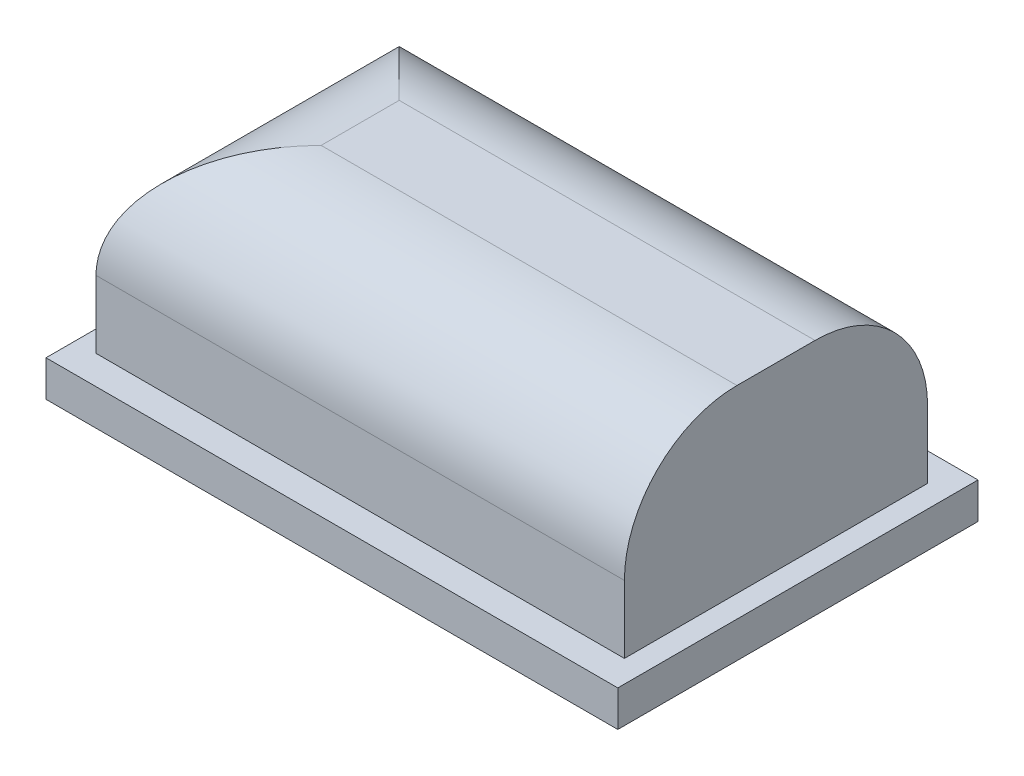
ISO-10303-21;
HEADER;
FILE_DESCRIPTION(('STEP AP214'),'2;1');
FILE_NAME('part.step','',(''),(''),'','','');
FILE_SCHEMA(('AUTOMOTIVE_DESIGN { 1 0 10303 214 1 1 1 1 }'));
ENDSEC;
DATA;
#1=APPLICATION_CONTEXT('core data for automotive mechanical design processes');
#2=APPLICATION_PROTOCOL_DEFINITION('international standard','automotive_design',2000,#1);
#3=PRODUCT_CONTEXT('',#1,'mechanical');
#4=PRODUCT('Part','Part','',(#3));
#5=PRODUCT_RELATED_PRODUCT_CATEGORY('part','',(#4));
#6=PRODUCT_DEFINITION_FORMATION('','',#4);
#7=PRODUCT_DEFINITION_CONTEXT('part definition',#1,'design');
#8=PRODUCT_DEFINITION('design','',#6,#7);
#9=PRODUCT_DEFINITION_SHAPE('','',#8);
#10=(LENGTH_UNIT() NAMED_UNIT(*) SI_UNIT(.MILLI.,.METRE.));
#11=(NAMED_UNIT(*) PLANE_ANGLE_UNIT() SI_UNIT($,.RADIAN.));
#12=(NAMED_UNIT(*) SI_UNIT($,.STERADIAN.) SOLID_ANGLE_UNIT());
#13=UNCERTAINTY_MEASURE_WITH_UNIT(LENGTH_MEASURE(1.E-05),#10,'distance_accuracy_value','');
#14=(GEOMETRIC_REPRESENTATION_CONTEXT(3) GLOBAL_UNCERTAINTY_ASSIGNED_CONTEXT((#13)) GLOBAL_UNIT_ASSIGNED_CONTEXT((#10,
#11,#12)) REPRESENTATION_CONTEXT('',''));
#15=CARTESIAN_POINT('',(0.,0.,0.));
#16=DIRECTION('',(0.,0.,1.));
#17=DIRECTION('',(1.,0.,0.));
#18=AXIS2_PLACEMENT_3D('',#15,#16,#17);
#19=CARTESIAN_POINT('',(0.,1.6,0.));
#20=DIRECTION('',(0.,-1.,0.));
#21=DIRECTION('',(0.,0.,-1.));
#22=AXIS2_PLACEMENT_3D('',#19,#20,#21);
#23=PLANE('',#22);
#24=DIRECTION('',(0.,0.,1.));
#25=VECTOR('',#24,1.);
#26=CARTESIAN_POINT('',(0.,1.6,0.));
#27=LINE('',#26,#25);
#28=CARTESIAN_POINT('',(0.,1.6,-16.));
#29=VERTEX_POINT('',#28);
#30=CARTESIAN_POINT('',(0.,1.6,0.));
#31=VERTEX_POINT('',#30);
#32=EDGE_CURVE('E140',#29,#31,#27,.T.);
#33=ORIENTED_EDGE('',*,*,#32,.T.);
#34=DIRECTION('',(1.,0.,0.));
#35=VECTOR('',#34,1.);
#36=CARTESIAN_POINT('',(0.,1.6,0.));
#37=LINE('',#36,#35);
#38=CARTESIAN_POINT('',(25.4,1.6,0.));
#39=VERTEX_POINT('',#38);
#40=EDGE_CURVE('E143',#31,#39,#37,.T.);
#41=ORIENTED_EDGE('',*,*,#40,.T.);
#42=DIRECTION('',(0.,0.,-1.));
#43=VECTOR('',#42,1.);
#44=CARTESIAN_POINT('',(25.4,1.6,0.));
#45=LINE('',#44,#43);
#46=CARTESIAN_POINT('',(25.4,1.6,-16.));
#47=VERTEX_POINT('',#46);
#48=EDGE_CURVE('E146',#39,#47,#45,.T.);
#49=ORIENTED_EDGE('',*,*,#48,.T.);
#50=DIRECTION('',(-1.,0.,0.));
#51=VECTOR('',#50,1.);
#52=CARTESIAN_POINT('',(0.,1.6,-16.));
#53=LINE('',#52,#51);
#54=EDGE_CURVE('E148',#47,#29,#53,.T.);
#55=ORIENTED_EDGE('',*,*,#54,.T.);
#56=EDGE_LOOP('',(#33,#41,#49,#55));
#57=FACE_BOUND('',#56,.T.);
#58=DIRECTION('',(0.,0.,1.));
#59=VECTOR('',#58,1.);
#60=CARTESIAN_POINT('',(0.941878804781027,1.6,-1.28026775479384));
#61=LINE('',#60,#59);
#62=CARTESIAN_POINT('',(0.941878804781027,1.6,-14.7469678998959));
#63=VERTEX_POINT('',#62);
#64=CARTESIAN_POINT('',(0.941878804781027,1.6,-1.28026775479384));
#65=VERTEX_POINT('',#64);
#66=EDGE_CURVE('E128',#63,#65,#61,.T.);
#67=ORIENTED_EDGE('',*,*,#66,.F.);
#68=DIRECTION('',(-1.,0.,0.));
#69=VECTOR('',#68,1.);
#70=CARTESIAN_POINT('',(0.941878804781027,1.6,-14.7469678998959));
#71=LINE('',#70,#69);
#72=CARTESIAN_POINT('',(24.413407163081,1.6,-14.7469678998959));
#73=VERTEX_POINT('',#72);
#74=EDGE_CURVE('E125',#73,#63,#71,.T.);
#75=ORIENTED_EDGE('',*,*,#74,.F.);
#76=DIRECTION('',(0.,0.,-1.));
#77=VECTOR('',#76,1.);
#78=CARTESIAN_POINT('',(24.413407163081,1.6,-1.28026775479384));
#79=LINE('',#78,#77);
#80=CARTESIAN_POINT('',(24.413407163081,1.6,-1.28026775479384));
#81=VERTEX_POINT('',#80);
#82=EDGE_CURVE('E113',#81,#73,#79,.T.);
#83=ORIENTED_EDGE('',*,*,#82,.F.);
#84=DIRECTION('',(1.,0.,0.));
#85=VECTOR('',#84,1.);
#86=CARTESIAN_POINT('',(0.941878804781027,1.6,-1.28026775479384));
#87=LINE('',#86,#85);
#88=EDGE_CURVE('E122',#65,#81,#87,.T.);
#89=ORIENTED_EDGE('',*,*,#88,.F.);
#90=EDGE_LOOP('',(#67,#75,#83,#89));
#91=FACE_BOUND('',#90,.T.);
#92=ADVANCED_FACE('F33',(#57,#91),#23,.F.);
#93=CARTESIAN_POINT('',(0.,1.6,0.));
#94=DIRECTION('',(1.,0.,0.));
#95=DIRECTION('',(0.,0.,-1.));
#96=AXIS2_PLACEMENT_3D('',#93,#94,#95);
#97=PLANE('',#96);
#98=DIRECTION('',(0.,0.,1.));
#99=VECTOR('',#98,1.);
#100=CARTESIAN_POINT('',(0.,0.,0.));
#101=LINE('',#100,#99);
#102=CARTESIAN_POINT('',(0.,0.,-16.));
#103=VERTEX_POINT('',#102);
#104=CARTESIAN_POINT('',(0.,0.,0.));
#105=VERTEX_POINT('',#104);
#106=EDGE_CURVE('E139',#103,#105,#101,.T.);
#107=ORIENTED_EDGE('',*,*,#106,.T.);
#108=DIRECTION('',(0.,-1.,0.));
#109=VECTOR('',#108,1.);
#110=CARTESIAN_POINT('',(0.,1.6,0.));
#111=LINE('',#110,#109);
#112=EDGE_CURVE('E166',#31,#105,#111,.T.);
#113=ORIENTED_EDGE('',*,*,#112,.F.);
#114=ORIENTED_EDGE('',*,*,#32,.F.);
#115=DIRECTION('',(0.,-1.,0.));
#116=VECTOR('',#115,1.);
#117=CARTESIAN_POINT('',(0.,1.6,-16.));
#118=LINE('',#117,#116);
#119=EDGE_CURVE('E150',#29,#103,#118,.T.);
#120=ORIENTED_EDGE('',*,*,#119,.T.);
#121=EDGE_LOOP('',(#107,#113,#114,#120));
#122=FACE_BOUND('',#121,.T.);
#123=ADVANCED_FACE('F217',(#122),#97,.F.);
#124=CARTESIAN_POINT('',(0.,1.6,0.));
#125=DIRECTION('',(0.,0.,-1.));
#126=DIRECTION('',(-1.,0.,0.));
#127=AXIS2_PLACEMENT_3D('',#124,#125,#126);
#128=PLANE('',#127);
#129=DIRECTION('',(1.,0.,0.));
#130=VECTOR('',#129,1.);
#131=CARTESIAN_POINT('',(0.,0.,0.));
#132=LINE('',#131,#130);
#133=CARTESIAN_POINT('',(25.4,0.,0.));
#134=VERTEX_POINT('',#133);
#135=EDGE_CURVE('E153',#105,#134,#132,.T.);
#136=ORIENTED_EDGE('',*,*,#135,.T.);
#137=DIRECTION('',(0.,-1.,0.));
#138=VECTOR('',#137,1.);
#139=CARTESIAN_POINT('',(25.4,1.6,0.));
#140=LINE('',#139,#138);
#141=EDGE_CURVE('E163',#39,#134,#140,.T.);
#142=ORIENTED_EDGE('',*,*,#141,.F.);
#143=ORIENTED_EDGE('',*,*,#40,.F.);
#144=ORIENTED_EDGE('',*,*,#112,.T.);
#145=EDGE_LOOP('',(#136,#142,#143,#144));
#146=FACE_BOUND('',#145,.T.);
#147=ADVANCED_FACE('F222',(#146),#128,.F.);
#148=CARTESIAN_POINT('',(25.4,1.6,0.));
#149=DIRECTION('',(-1.,0.,0.));
#150=DIRECTION('',(0.,0.,1.));
#151=AXIS2_PLACEMENT_3D('',#148,#149,#150);
#152=PLANE('',#151);
#153=DIRECTION('',(0.,0.,-1.));
#154=VECTOR('',#153,1.);
#155=CARTESIAN_POINT('',(25.4,0.,0.));
#156=LINE('',#155,#154);
#157=CARTESIAN_POINT('',(25.4,0.,-16.));
#158=VERTEX_POINT('',#157);
#159=EDGE_CURVE('E155',#134,#158,#156,.T.);
#160=ORIENTED_EDGE('',*,*,#159,.T.);
#161=DIRECTION('',(0.,-1.,0.));
#162=VECTOR('',#161,1.);
#163=CARTESIAN_POINT('',(25.4,1.6,-16.));
#164=LINE('',#163,#162);
#165=EDGE_CURVE('E160',#47,#158,#164,.T.);
#166=ORIENTED_EDGE('',*,*,#165,.F.);
#167=ORIENTED_EDGE('',*,*,#48,.F.);
#168=ORIENTED_EDGE('',*,*,#141,.T.);
#169=EDGE_LOOP('',(#160,#166,#167,#168));
#170=FACE_BOUND('',#169,.T.);
#171=ADVANCED_FACE('F228',(#170),#152,.F.);
#172=CARTESIAN_POINT('',(0.,1.6,-16.));
#173=DIRECTION('',(0.,0.,1.));
#174=DIRECTION('',(1.,0.,0.));
#175=AXIS2_PLACEMENT_3D('',#172,#173,#174);
#176=PLANE('',#175);
#177=DIRECTION('',(-1.,0.,0.));
#178=VECTOR('',#177,1.);
#179=CARTESIAN_POINT('',(0.,0.,-16.));
#180=LINE('',#179,#178);
#181=EDGE_CURVE('E144',#158,#103,#180,.T.);
#182=ORIENTED_EDGE('',*,*,#181,.T.);
#183=ORIENTED_EDGE('',*,*,#119,.F.);
#184=ORIENTED_EDGE('',*,*,#54,.F.);
#185=ORIENTED_EDGE('',*,*,#165,.T.);
#186=EDGE_LOOP('',(#182,#183,#184,#185));
#187=FACE_BOUND('',#186,.T.);
#188=ADVANCED_FACE('F212',(#187),#176,.F.);
#189=CARTESIAN_POINT('',(0.,0.,0.));
#190=DIRECTION('',(0.,-1.,0.));
#191=DIRECTION('',(0.,0.,-1.));
#192=AXIS2_PLACEMENT_3D('',#189,#190,#191);
#193=PLANE('',#192);
#194=ORIENTED_EDGE('',*,*,#106,.F.);
#195=ORIENTED_EDGE('',*,*,#181,.F.);
#196=ORIENTED_EDGE('',*,*,#159,.F.);
#197=ORIENTED_EDGE('',*,*,#135,.F.);
#198=EDGE_LOOP('',(#194,#195,#196,#197));
#199=FACE_BOUND('',#198,.T.);
#200=ADVANCED_FACE('F205',(#199),#193,.T.);
#201=CARTESIAN_POINT('',(0.941878804781027,9.6,-1.28026775479384));
#202=DIRECTION('',(1.,0.,0.));
#203=DIRECTION('',(0.,0.,-1.));
#204=AXIS2_PLACEMENT_3D('',#201,#202,#203);
#205=PLANE('',#204);
#206=DIRECTION('',(0.,-1.,0.));
#207=VECTOR('',#206,1.);
#208=CARTESIAN_POINT('',(0.941878804781027,9.6,-1.28026775479384));
#209=LINE('',#208,#207);
#210=CARTESIAN_POINT('',(0.941878804781027,4.6,-1.28026775479384));
#211=VERTEX_POINT('',#210);
#212=EDGE_CURVE('E115',#211,#65,#209,.T.);
#213=ORIENTED_EDGE('',*,*,#212,.F.);
#214=DIRECTION('',(0.,0.,1.));
#215=VECTOR('',#214,1.);
#216=CARTESIAN_POINT('',(0.941878804781027,4.6,-1.28026775479384));
#217=LINE('',#216,#215);
#218=CARTESIAN_POINT('',(0.941878804781027,4.6,-14.7469678998959));
#219=VERTEX_POINT('',#218);
#220=EDGE_CURVE('E11',#211,#219,#217,.F.);
#221=ORIENTED_EDGE('',*,*,#220,.T.);
#222=DIRECTION('',(0.,-1.,0.));
#223=VECTOR('',#222,1.);
#224=CARTESIAN_POINT('',(0.941878804781027,9.6,-14.7469678998959));
#225=LINE('',#224,#223);
#226=EDGE_CURVE('E135',#219,#63,#225,.T.);
#227=ORIENTED_EDGE('',*,*,#226,.T.);
#228=ORIENTED_EDGE('',*,*,#66,.T.);
#229=EDGE_LOOP('',(#213,#221,#227,#228));
#230=FACE_BOUND('',#229,.T.);
#231=ADVANCED_FACE('F203',(#230),#205,.F.);
#232=CARTESIAN_POINT('',(0.941878804781027,9.6,-1.28026775479384));
#233=DIRECTION('',(0.,0.,-1.));
#234=DIRECTION('',(-1.,0.,0.));
#235=AXIS2_PLACEMENT_3D('',#232,#233,#234);
#236=PLANE('',#235);
#237=DIRECTION('',(0.,-1.,0.));
#238=VECTOR('',#237,1.);
#239=CARTESIAN_POINT('',(24.413407163081,9.6,-1.28026775479384));
#240=LINE('',#239,#238);
#241=CARTESIAN_POINT('',(24.413407163081,4.6,-1.28026775479384));
#242=VERTEX_POINT('',#241);
#243=EDGE_CURVE('E109',#242,#81,#240,.T.);
#244=ORIENTED_EDGE('',*,*,#243,.F.);
#245=DIRECTION('',(1.,0.,0.));
#246=VECTOR('',#245,1.);
#247=CARTESIAN_POINT('',(0.941878804781027,4.6,-1.28026775479384));
#248=LINE('',#247,#246);
#249=EDGE_CURVE('E42',#242,#211,#248,.F.);
#250=ORIENTED_EDGE('',*,*,#249,.T.);
#251=ORIENTED_EDGE('',*,*,#212,.T.);
#252=ORIENTED_EDGE('',*,*,#88,.T.);
#253=EDGE_LOOP('',(#244,#250,#251,#252));
#254=FACE_BOUND('',#253,.T.);
#255=ADVANCED_FACE('F127',(#254),#236,.F.);
#256=CARTESIAN_POINT('',(24.413407163081,9.6,-1.28026775479384));
#257=DIRECTION('',(-1.,0.,0.));
#258=DIRECTION('',(0.,0.,1.));
#259=AXIS2_PLACEMENT_3D('',#256,#257,#258);
#260=PLANE('',#259);
#261=DIRECTION('',(0.,-1.,0.));
#262=VECTOR('',#261,1.);
#263=CARTESIAN_POINT('',(24.413407163081,9.6,-14.7469678998959));
#264=LINE('',#263,#262);
#265=CARTESIAN_POINT('',(24.413407163081,4.6,-14.7469678998959));
#266=VERTEX_POINT('',#265);
#267=EDGE_CURVE('E116',#266,#73,#264,.T.);
#268=ORIENTED_EDGE('',*,*,#267,.F.);
#269=CARTESIAN_POINT('',(24.413407163081,4.6,-9.74696789989593));
#270=DIRECTION('',(-1.,0.,0.));
#271=DIRECTION('',(0.,0.,1.));
#272=AXIS2_PLACEMENT_3D('',#269,#270,#271);
#273=CIRCLE('',#272,5.);
#274=CARTESIAN_POINT('',(24.413407163081,9.6,-9.74696789989593));
#275=VERTEX_POINT('',#274);
#276=EDGE_CURVE('E179',#266,#275,#273,.F.);
#277=ORIENTED_EDGE('',*,*,#276,.T.);
#278=DIRECTION('',(0.,0.,-1.));
#279=VECTOR('',#278,1.);
#280=CARTESIAN_POINT('',(24.413407163081,9.6,-1.28026775479384));
#281=LINE('',#280,#279);
#282=CARTESIAN_POINT('',(24.413407163081,9.6,-6.28026775479384));
#283=VERTEX_POINT('',#282);
#284=EDGE_CURVE('E134',#283,#275,#281,.T.);
#285=ORIENTED_EDGE('',*,*,#284,.F.);
#286=CARTESIAN_POINT('',(24.413407163081,4.6,-6.28026775479384));
#287=DIRECTION('',(-1.,0.,0.));
#288=DIRECTION('',(0.,0.,1.));
#289=AXIS2_PLACEMENT_3D('',#286,#287,#288);
#290=CIRCLE('',#289,5.);
#291=EDGE_CURVE('E57',#283,#242,#290,.F.);
#292=ORIENTED_EDGE('',*,*,#291,.T.);
#293=ORIENTED_EDGE('',*,*,#243,.T.);
#294=ORIENTED_EDGE('',*,*,#82,.T.);
#295=EDGE_LOOP('',(#268,#277,#285,#292,#293,#294));
#296=FACE_BOUND('',#295,.T.);
#297=ADVANCED_FACE('F112',(#296),#260,.F.);
#298=CARTESIAN_POINT('',(0.941878804781027,9.6,-14.7469678998959));
#299=DIRECTION('',(0.,0.,1.));
#300=DIRECTION('',(1.,0.,0.));
#301=AXIS2_PLACEMENT_3D('',#298,#299,#300);
#302=PLANE('',#301);
#303=ORIENTED_EDGE('',*,*,#226,.F.);
#304=DIRECTION('',(-1.,0.,0.));
#305=VECTOR('',#304,1.);
#306=CARTESIAN_POINT('',(0.941878804781027,4.6,-14.7469678998959));
#307=LINE('',#306,#305);
#308=EDGE_CURVE('E176',#219,#266,#307,.F.);
#309=ORIENTED_EDGE('',*,*,#308,.T.);
#310=ORIENTED_EDGE('',*,*,#267,.T.);
#311=ORIENTED_EDGE('',*,*,#74,.T.);
#312=EDGE_LOOP('',(#303,#309,#310,#311));
#313=FACE_BOUND('',#312,.T.);
#314=ADVANCED_FACE('F201',(#313),#302,.F.);
#315=CARTESIAN_POINT('',(0.,9.6,0.));
#316=DIRECTION('',(0.,-1.,0.));
#317=DIRECTION('',(0.,0.,-1.));
#318=AXIS2_PLACEMENT_3D('',#315,#316,#317);
#319=PLANE('',#318);
#320=ORIENTED_EDGE('',*,*,#284,.T.);
#321=DIRECTION('',(-1.,0.,0.));
#322=VECTOR('',#321,1.);
#323=CARTESIAN_POINT('',(0.,9.6,-9.74696789989593));
#324=LINE('',#323,#322);
#325=CARTESIAN_POINT('',(5.94187880478103,9.6,-9.74696789989593));
#326=VERTEX_POINT('',#325);
#327=EDGE_CURVE('E173',#275,#326,#324,.T.);
#328=ORIENTED_EDGE('',*,*,#327,.T.);
#329=DIRECTION('',(0.,0.,1.));
#330=VECTOR('',#329,1.);
#331=CARTESIAN_POINT('',(5.94187880478103,9.6,0.));
#332=LINE('',#331,#330);
#333=CARTESIAN_POINT('',(5.94187880478103,9.6,-6.28026775479384));
#334=VERTEX_POINT('',#333);
#335=EDGE_CURVE('E169',#326,#334,#332,.T.);
#336=ORIENTED_EDGE('',*,*,#335,.T.);
#337=DIRECTION('',(1.,0.,0.));
#338=VECTOR('',#337,1.);
#339=CARTESIAN_POINT('',(0.,9.6,-6.28026775479384));
#340=LINE('',#339,#338);
#341=EDGE_CURVE('E171',#334,#283,#340,.T.);
#342=ORIENTED_EDGE('',*,*,#341,.T.);
#343=EDGE_LOOP('',(#320,#328,#336,#342));
#344=FACE_BOUND('',#343,.T.);
#345=ADVANCED_FACE('F196',(#344),#319,.F.);
#346=CARTESIAN_POINT('',(0.,4.6,-6.28026775479384));
#347=DIRECTION('',(1.,0.,0.));
#348=DIRECTION('',(0.,0.,-1.));
#349=AXIS2_PLACEMENT_3D('',#346,#347,#348);
#350=CYLINDRICAL_SURFACE('',#349,5.);
#351=ORIENTED_EDGE('',*,*,#291,.F.);
#352=ORIENTED_EDGE('',*,*,#341,.F.);
#353=CARTESIAN_POINT('',(5.94187880478103,4.6,-6.28026775479384));
#354=DIRECTION('',(0.707106781186547,0.,0.707106781186547));
#355=DIRECTION('',(-0.707106781186547,0.,0.707106781186547));
#356=AXIS2_PLACEMENT_3D('',#353,#354,#355);
#357=ELLIPSE('',#356,7.07106781186547,5.);
#358=EDGE_CURVE('E37',#211,#334,#357,.F.);
#359=ORIENTED_EDGE('',*,*,#358,.F.);
#360=ORIENTED_EDGE('',*,*,#249,.F.);
#361=EDGE_LOOP('',(#351,#352,#359,#360));
#362=FACE_BOUND('',#361,.T.);
#363=ADVANCED_FACE('F35',(#362),#350,.T.);
#364=CARTESIAN_POINT('',(5.94187880478103,4.6,0.));
#365=DIRECTION('',(0.,0.,1.));
#366=DIRECTION('',(1.,0.,0.));
#367=AXIS2_PLACEMENT_3D('',#364,#365,#366);
#368=CYLINDRICAL_SURFACE('',#367,5.);
#369=ORIENTED_EDGE('',*,*,#358,.T.);
#370=ORIENTED_EDGE('',*,*,#335,.F.);
#371=CARTESIAN_POINT('',(5.94187880478103,4.6,-9.74696789989593));
#372=DIRECTION('',(-0.707106781186547,0.,0.707106781186547));
#373=DIRECTION('',(0.707106781186547,0.,0.707106781186547));
#374=AXIS2_PLACEMENT_3D('',#371,#372,#373);
#375=ELLIPSE('',#374,7.07106781186547,5.);
#376=EDGE_CURVE('E181',#219,#326,#375,.F.);
#377=ORIENTED_EDGE('',*,*,#376,.F.);
#378=ORIENTED_EDGE('',*,*,#220,.F.);
#379=EDGE_LOOP('',(#369,#370,#377,#378));
#380=FACE_BOUND('',#379,.T.);
#381=ADVANCED_FACE('F191',(#380),#368,.T.);
#382=CARTESIAN_POINT('',(0.,4.6,-9.74696789989593));
#383=DIRECTION('',(-1.,0.,0.));
#384=DIRECTION('',(0.,0.,1.));
#385=AXIS2_PLACEMENT_3D('',#382,#383,#384);
#386=CYLINDRICAL_SURFACE('',#385,5.);
#387=ORIENTED_EDGE('',*,*,#276,.F.);
#388=ORIENTED_EDGE('',*,*,#308,.F.);
#389=ORIENTED_EDGE('',*,*,#376,.T.);
#390=ORIENTED_EDGE('',*,*,#327,.F.);
#391=EDGE_LOOP('',(#387,#388,#389,#390));
#392=FACE_BOUND('',#391,.T.);
#393=ADVANCED_FACE('F198',(#392),#386,.T.);
#394=CLOSED_SHELL('',(#92,#123,#147,#171,#188,#200,#231,#255,#297,#314,#345,#363,#381,#393));
#395=MANIFOLD_SOLID_BREP('B2',#394);
#396=ADVANCED_BREP_SHAPE_REPRESENTATION('',(#18,#395),#14);
#397=SHAPE_DEFINITION_REPRESENTATION(#9,#396);
ENDSEC;
END-ISO-10303-21;
